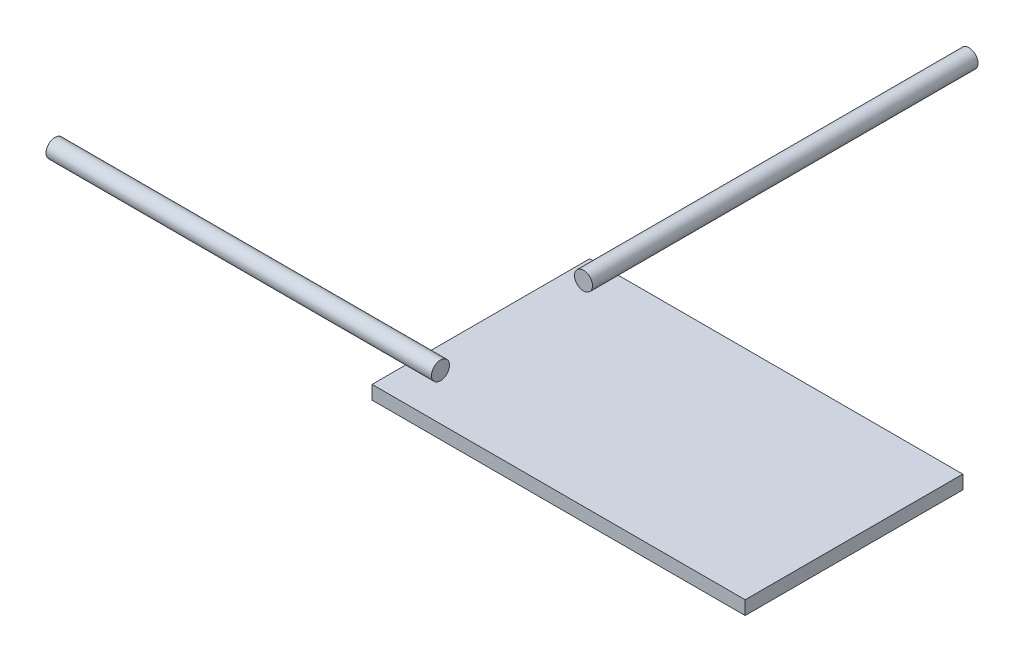
ISO-10303-21;
HEADER;
FILE_DESCRIPTION(('STEP AP214'),'2;1');
FILE_NAME('part.step','',(''),(''),'','','');
FILE_SCHEMA(('AUTOMOTIVE_DESIGN { 1 0 10303 214 1 1 1 1 }'));
ENDSEC;
DATA;
#1=APPLICATION_CONTEXT('core data for automotive mechanical design processes');
#2=APPLICATION_PROTOCOL_DEFINITION('international standard','automotive_design',2000,#1);
#3=PRODUCT_CONTEXT('',#1,'mechanical');
#4=PRODUCT('Part','Part','',(#3));
#5=PRODUCT_RELATED_PRODUCT_CATEGORY('part','',(#4));
#6=PRODUCT_DEFINITION_FORMATION('','',#4);
#7=PRODUCT_DEFINITION_CONTEXT('part definition',#1,'design');
#8=PRODUCT_DEFINITION('design','',#6,#7);
#9=PRODUCT_DEFINITION_SHAPE('','',#8);
#10=(LENGTH_UNIT() NAMED_UNIT(*) SI_UNIT(.MILLI.,.METRE.));
#11=(NAMED_UNIT(*) PLANE_ANGLE_UNIT() SI_UNIT($,.RADIAN.));
#12=(NAMED_UNIT(*) SI_UNIT($,.STERADIAN.) SOLID_ANGLE_UNIT());
#13=UNCERTAINTY_MEASURE_WITH_UNIT(LENGTH_MEASURE(1.E-05),#10,'distance_accuracy_value','');
#14=(GEOMETRIC_REPRESENTATION_CONTEXT(3) GLOBAL_UNCERTAINTY_ASSIGNED_CONTEXT((#13)) GLOBAL_UNIT_ASSIGNED_CONTEXT((#10,
#11,#12)) REPRESENTATION_CONTEXT('',''));
#15=CARTESIAN_POINT('',(0.,0.,0.));
#16=DIRECTION('',(0.,0.,1.));
#17=DIRECTION('',(1.,0.,0.));
#18=AXIS2_PLACEMENT_3D('',#15,#16,#17);
#19=CARTESIAN_POINT('',(-43.5,1.825,5.75000000000001));
#20=DIRECTION('',(1.,0.,0.));
#21=DIRECTION('',(0.,0.,-1.));
#22=AXIS2_PLACEMENT_3D('',#19,#20,#21);
#23=CYLINDRICAL_SURFACE('',#22,0.725);
#24=CARTESIAN_POINT('',(-43.5,1.825,5.75000000000001));
#25=DIRECTION('',(-1.,0.,0.));
#26=DIRECTION('',(0.,0.,1.));
#27=AXIS2_PLACEMENT_3D('',#24,#25,#26);
#28=CIRCLE('',#27,0.725);
#29=CARTESIAN_POINT('',(-43.5,1.825,5.02500000000001));
#30=VERTEX_POINT('',#29);
#31=EDGE_CURVE('E11',#30,#30,#28,.T.);
#32=CARTESIAN_POINT('',(-12.5,1.825,5.75));
#33=DIRECTION('',(1.,0.,0.));
#34=DIRECTION('',(0.,0.,-1.));
#35=AXIS2_PLACEMENT_3D('',#32,#33,#34);
#36=CIRCLE('',#35,0.725);
#37=CARTESIAN_POINT('',(-12.5,1.825,5.025));
#38=VERTEX_POINT('',#37);
#39=EDGE_CURVE('E46',#38,#38,#36,.T.);
#40=CARTESIAN_POINT('',(-43.5,1.825,5.02500000000001));
#41=CARTESIAN_POINT('',(-43.1770833333333,1.825,5.02500000000001));
#42=CARTESIAN_POINT('',(-42.8541666666667,1.825,5.02500000000001));
#43=CARTESIAN_POINT('',(-42.2083333333333,1.825,5.02500000000001));
#44=CARTESIAN_POINT('',(-41.8854166666667,1.825,5.02500000000001));
#45=CARTESIAN_POINT('',(-41.2395833333333,1.825,5.02500000000001));
#46=CARTESIAN_POINT('',(-40.9166666666667,1.825,5.02500000000001));
#47=CARTESIAN_POINT('',(-40.2708333333333,1.825,5.02500000000001));
#48=CARTESIAN_POINT('',(-39.9479166666667,1.825,5.02500000000001));
#49=CARTESIAN_POINT('',(-39.3020833333333,1.825,5.02500000000001));
#50=CARTESIAN_POINT('',(-38.9791666666667,1.825,5.02500000000001));
#51=CARTESIAN_POINT('',(-38.3333333333333,1.825,5.02500000000001));
#52=CARTESIAN_POINT('',(-38.0104166666667,1.825,5.02500000000001));
#53=CARTESIAN_POINT('',(-37.3645833333333,1.825,5.02500000000001));
#54=CARTESIAN_POINT('',(-37.0416666666667,1.825,5.02500000000001));
#55=CARTESIAN_POINT('',(-36.3958333333333,1.825,5.02500000000001));
#56=CARTESIAN_POINT('',(-36.0729166666667,1.825,5.02500000000001));
#57=CARTESIAN_POINT('',(-35.4270833333333,1.825,5.02500000000001));
#58=CARTESIAN_POINT('',(-35.1041666666667,1.825,5.02500000000001));
#59=CARTESIAN_POINT('',(-34.4583333333333,1.825,5.02500000000001));
#60=CARTESIAN_POINT('',(-34.1354166666667,1.825,5.02500000000001));
#61=CARTESIAN_POINT('',(-33.4895833333333,1.825,5.02500000000001));
#62=CARTESIAN_POINT('',(-33.1666666666667,1.825,5.02500000000001));
#63=CARTESIAN_POINT('',(-32.5208333333333,1.825,5.02500000000001));
#64=CARTESIAN_POINT('',(-32.1979166666667,1.825,5.02500000000001));
#65=CARTESIAN_POINT('',(-31.5520833333333,1.825,5.02500000000001));
#66=CARTESIAN_POINT('',(-31.2291666666667,1.825,5.02500000000001));
#67=CARTESIAN_POINT('',(-30.5833333333333,1.825,5.02500000000001));
#68=CARTESIAN_POINT('',(-30.2604166666667,1.825,5.025));
#69=CARTESIAN_POINT('',(-29.6145833333333,1.825,5.025));
#70=CARTESIAN_POINT('',(-29.2916666666667,1.825,5.025));
#71=CARTESIAN_POINT('',(-28.6458333333333,1.825,5.025));
#72=CARTESIAN_POINT('',(-28.3229166666667,1.825,5.025));
#73=CARTESIAN_POINT('',(-27.6770833333333,1.825,5.025));
#74=CARTESIAN_POINT('',(-27.3541666666667,1.825,5.025));
#75=CARTESIAN_POINT('',(-26.7083333333333,1.825,5.025));
#76=CARTESIAN_POINT('',(-26.3854166666667,1.825,5.025));
#77=CARTESIAN_POINT('',(-25.7395833333333,1.825,5.025));
#78=CARTESIAN_POINT('',(-25.4166666666667,1.825,5.025));
#79=CARTESIAN_POINT('',(-24.7708333333333,1.825,5.025));
#80=CARTESIAN_POINT('',(-24.4479166666667,1.825,5.025));
#81=CARTESIAN_POINT('',(-23.8020833333333,1.825,5.025));
#82=CARTESIAN_POINT('',(-23.4791666666667,1.825,5.025));
#83=CARTESIAN_POINT('',(-22.8333333333333,1.825,5.025));
#84=CARTESIAN_POINT('',(-22.5104166666667,1.825,5.025));
#85=CARTESIAN_POINT('',(-21.8645833333333,1.825,5.025));
#86=CARTESIAN_POINT('',(-21.5416666666667,1.825,5.025));
#87=CARTESIAN_POINT('',(-20.8958333333333,1.825,5.025));
#88=CARTESIAN_POINT('',(-20.5729166666667,1.825,5.025));
#89=CARTESIAN_POINT('',(-19.9270833333333,1.825,5.025));
#90=CARTESIAN_POINT('',(-19.6041666666667,1.825,5.025));
#91=CARTESIAN_POINT('',(-18.9583333333333,1.825,5.025));
#92=CARTESIAN_POINT('',(-18.6354166666667,1.825,5.025));
#93=CARTESIAN_POINT('',(-17.9895833333333,1.825,5.025));
#94=CARTESIAN_POINT('',(-17.6666666666667,1.825,5.025));
#95=CARTESIAN_POINT('',(-17.0208333333333,1.825,5.025));
#96=CARTESIAN_POINT('',(-16.6979166666667,1.825,5.025));
#97=CARTESIAN_POINT('',(-16.0520833333333,1.825,5.025));
#98=CARTESIAN_POINT('',(-15.7291666666667,1.825,5.025));
#99=CARTESIAN_POINT('',(-15.0833333333333,1.825,5.025));
#100=CARTESIAN_POINT('',(-14.7604166666667,1.825,5.025));
#101=CARTESIAN_POINT('',(-14.1145833333333,1.825,5.025));
#102=CARTESIAN_POINT('',(-13.7916666666667,1.825,5.025));
#103=CARTESIAN_POINT('',(-13.1458333333333,1.825,5.025));
#104=CARTESIAN_POINT('',(-12.8229166666667,1.825,5.025));
#105=CARTESIAN_POINT('',(-12.5,1.825,5.025));
#106=B_SPLINE_CURVE_WITH_KNOTS('',3,(#40,#41,#42,#43,#44,#45,#46,#47,#48,#49,#50,#51,#52,#53,
#54,#55,#56,#57,#58,#59,#60,#61,#62,#63,#64,#65,#66,#67,#68,#69,#70,#71,#72,#73,#74,#75,#76,#77,
#78,#79,#80,#81,#82,#83,#84,#85,#86,#87,#88,#89,#90,#91,#92,#93,#94,#95,#96,#97,#98,#99,#100,
#101,#102,#103,#104,#105),.UNSPECIFIED.,.F.,.F.,(4,2,2,2,2,2,2,2,2,2,2,2,2,2,2,2,2,2,2,2,2,2,2,
2,2,2,2,2,2,2,2,2,4),(0.,0.968750000000004,1.9375,2.90625000000001,3.875,4.84375,
5.81250000000001,6.78125,7.75,8.71875,9.6875,10.65625,11.625,12.59375,13.5625,14.53125,15.5,
16.46875,17.4375,18.40625,19.375,20.34375,21.3125,22.28125,23.25,24.21875,25.1875,26.15625,
27.125,28.09375,29.0625,30.03125,31.),.UNSPECIFIED.);
#107=EDGE_CURVE('BSEAM40',#30,#38,#106,.T.);
#108=ORIENTED_EDGE('',*,*,#31,.F.);
#109=ORIENTED_EDGE('',*,*,#39,.F.);
#110=ORIENTED_EDGE('',*,*,#107,.T.);
#111=ORIENTED_EDGE('',*,*,#107,.F.);
#112=EDGE_LOOP('',(#108,#110,#109,#111));
#113=FACE_BOUND('',#112,.T.);
#114=ADVANCED_FACE('F40',(#113),#23,.T.);
#115=CARTESIAN_POINT('',(-43.5,1.825,5.75000000000001));
#116=DIRECTION('',(-1.,0.,0.));
#117=DIRECTION('',(0.,0.,1.));
#118=AXIS2_PLACEMENT_3D('',#115,#116,#117);
#119=PLANE('',#118);
#120=ORIENTED_EDGE('',*,*,#31,.T.);
#121=EDGE_LOOP('',(#120));
#122=FACE_BOUND('',#121,.T.);
#123=ADVANCED_FACE('F55',(#122),#119,.T.);
#124=CARTESIAN_POINT('',(-12.5,1.825,5.75));
#125=DIRECTION('',(1.,0.,0.));
#126=DIRECTION('',(0.,0.,-1.));
#127=AXIS2_PLACEMENT_3D('',#124,#125,#126);
#128=PLANE('',#127);
#129=ORIENTED_EDGE('',*,*,#39,.T.);
#130=EDGE_LOOP('',(#129));
#131=FACE_BOUND('',#130,.T.);
#132=ADVANCED_FACE('F52',(#131),#128,.T.);
#133=CLOSED_SHELL('',(#114,#123,#132));
#134=MANIFOLD_SOLID_BREP('B2',#133);
#135=CARTESIAN_POINT('',(-13.,1.825,-37.25));
#136=DIRECTION('',(0.,0.,1.));
#137=DIRECTION('',(1.,0.,0.));
#138=AXIS2_PLACEMENT_3D('',#135,#136,#137);
#139=CYLINDRICAL_SURFACE('',#138,0.725);
#140=CARTESIAN_POINT('',(-13.,1.825,-37.25));
#141=DIRECTION('',(0.,0.,-1.));
#142=DIRECTION('',(-1.,0.,0.));
#143=AXIS2_PLACEMENT_3D('',#140,#141,#142);
#144=CIRCLE('',#143,0.725);
#145=CARTESIAN_POINT('',(-12.275,1.825,-37.25));
#146=VERTEX_POINT('',#145);
#147=EDGE_CURVE('E39',#146,#146,#144,.T.);
#148=CARTESIAN_POINT('',(-13.,1.825,-6.25));
#149=DIRECTION('',(0.,0.,1.));
#150=DIRECTION('',(1.,0.,0.));
#151=AXIS2_PLACEMENT_3D('',#148,#149,#150);
#152=CIRCLE('',#151,0.725);
#153=CARTESIAN_POINT('',(-12.275,1.825,-6.25));
#154=VERTEX_POINT('',#153);
#155=EDGE_CURVE('E99',#154,#154,#152,.T.);
#156=CARTESIAN_POINT('',(-12.275,1.825,-37.25));
#157=CARTESIAN_POINT('',(-12.275,1.825,-36.9270833333333));
#158=CARTESIAN_POINT('',(-12.275,1.825,-36.6041666666667));
#159=CARTESIAN_POINT('',(-12.275,1.825,-35.9583333333333));
#160=CARTESIAN_POINT('',(-12.275,1.825,-35.6354166666667));
#161=CARTESIAN_POINT('',(-12.275,1.825,-34.9895833333333));
#162=CARTESIAN_POINT('',(-12.275,1.825,-34.6666666666667));
#163=CARTESIAN_POINT('',(-12.275,1.825,-34.0208333333333));
#164=CARTESIAN_POINT('',(-12.275,1.825,-33.6979166666667));
#165=CARTESIAN_POINT('',(-12.275,1.825,-33.0520833333333));
#166=CARTESIAN_POINT('',(-12.275,1.825,-32.7291666666667));
#167=CARTESIAN_POINT('',(-12.275,1.825,-32.0833333333333));
#168=CARTESIAN_POINT('',(-12.275,1.825,-31.7604166666667));
#169=CARTESIAN_POINT('',(-12.275,1.825,-31.1145833333333));
#170=CARTESIAN_POINT('',(-12.275,1.825,-30.7916666666667));
#171=CARTESIAN_POINT('',(-12.275,1.825,-30.1458333333333));
#172=CARTESIAN_POINT('',(-12.275,1.825,-29.8229166666667));
#173=CARTESIAN_POINT('',(-12.275,1.825,-29.1770833333333));
#174=CARTESIAN_POINT('',(-12.275,1.825,-28.8541666666667));
#175=CARTESIAN_POINT('',(-12.275,1.825,-28.2083333333333));
#176=CARTESIAN_POINT('',(-12.275,1.825,-27.8854166666667));
#177=CARTESIAN_POINT('',(-12.275,1.825,-27.2395833333333));
#178=CARTESIAN_POINT('',(-12.275,1.825,-26.9166666666667));
#179=CARTESIAN_POINT('',(-12.275,1.825,-26.2708333333333));
#180=CARTESIAN_POINT('',(-12.275,1.825,-25.9479166666667));
#181=CARTESIAN_POINT('',(-12.275,1.825,-25.3020833333333));
#182=CARTESIAN_POINT('',(-12.275,1.825,-24.9791666666667));
#183=CARTESIAN_POINT('',(-12.275,1.825,-24.3333333333333));
#184=CARTESIAN_POINT('',(-12.275,1.825,-24.0104166666667));
#185=CARTESIAN_POINT('',(-12.275,1.825,-23.3645833333333));
#186=CARTESIAN_POINT('',(-12.275,1.825,-23.0416666666667));
#187=CARTESIAN_POINT('',(-12.275,1.825,-22.3958333333333));
#188=CARTESIAN_POINT('',(-12.275,1.825,-22.0729166666667));
#189=CARTESIAN_POINT('',(-12.275,1.825,-21.4270833333333));
#190=CARTESIAN_POINT('',(-12.275,1.825,-21.1041666666667));
#191=CARTESIAN_POINT('',(-12.275,1.825,-20.4583333333333));
#192=CARTESIAN_POINT('',(-12.275,1.825,-20.1354166666667));
#193=CARTESIAN_POINT('',(-12.275,1.825,-19.4895833333333));
#194=CARTESIAN_POINT('',(-12.275,1.825,-19.1666666666667));
#195=CARTESIAN_POINT('',(-12.275,1.825,-18.5208333333333));
#196=CARTESIAN_POINT('',(-12.275,1.825,-18.1979166666667));
#197=CARTESIAN_POINT('',(-12.275,1.825,-17.5520833333333));
#198=CARTESIAN_POINT('',(-12.275,1.825,-17.2291666666667));
#199=CARTESIAN_POINT('',(-12.275,1.825,-16.5833333333333));
#200=CARTESIAN_POINT('',(-12.275,1.825,-16.2604166666667));
#201=CARTESIAN_POINT('',(-12.275,1.825,-15.6145833333333));
#202=CARTESIAN_POINT('',(-12.275,1.825,-15.2916666666667));
#203=CARTESIAN_POINT('',(-12.275,1.825,-14.6458333333333));
#204=CARTESIAN_POINT('',(-12.275,1.825,-14.3229166666667));
#205=CARTESIAN_POINT('',(-12.275,1.825,-13.6770833333333));
#206=CARTESIAN_POINT('',(-12.275,1.825,-13.3541666666667));
#207=CARTESIAN_POINT('',(-12.275,1.825,-12.7083333333333));
#208=CARTESIAN_POINT('',(-12.275,1.825,-12.3854166666667));
#209=CARTESIAN_POINT('',(-12.275,1.825,-11.7395833333333));
#210=CARTESIAN_POINT('',(-12.275,1.825,-11.4166666666667));
#211=CARTESIAN_POINT('',(-12.275,1.825,-10.7708333333333));
#212=CARTESIAN_POINT('',(-12.275,1.825,-10.4479166666667));
#213=CARTESIAN_POINT('',(-12.275,1.825,-9.80208333333333));
#214=CARTESIAN_POINT('',(-12.275,1.825,-9.47916666666667));
#215=CARTESIAN_POINT('',(-12.275,1.825,-8.83333333333334));
#216=CARTESIAN_POINT('',(-12.275,1.825,-8.51041666666667));
#217=CARTESIAN_POINT('',(-12.275,1.825,-7.86458333333334));
#218=CARTESIAN_POINT('',(-12.275,1.825,-7.54166666666667));
#219=CARTESIAN_POINT('',(-12.275,1.825,-6.89583333333334));
#220=CARTESIAN_POINT('',(-12.275,1.825,-6.57291666666667));
#221=CARTESIAN_POINT('',(-12.275,1.825,-6.25));
#222=B_SPLINE_CURVE_WITH_KNOTS('',3,(#156,#157,#158,#159,#160,#161,#162,#163,#164,#165,#166,
#167,#168,#169,#170,#171,#172,#173,#174,#175,#176,#177,#178,#179,#180,#181,#182,#183,#184,#185,
#186,#187,#188,#189,#190,#191,#192,#193,#194,#195,#196,#197,#198,#199,#200,#201,#202,#203,#204,
#205,#206,#207,#208,#209,#210,#211,#212,#213,#214,#215,#216,#217,#218,#219,#220,#221),
.UNSPECIFIED.,.F.,.F.,(4,2,2,2,2,2,2,2,2,2,2,2,2,2,2,2,2,2,2,2,2,2,2,2,2,2,2,2,2,2,2,2,4),(0.,
0.968750000000004,1.9375,2.90625000000001,3.875,4.84375,5.81250000000001,6.78125,7.75,8.71875,
9.6875,10.65625,11.625,12.59375,13.5625,14.53125,15.5,16.46875,17.4375,18.40625,19.375,20.34375,
21.3125,22.28125,23.25,24.21875,25.1875,26.15625,27.125,28.09375,29.0625,30.03125,31.),.UNSPECIFIED.);
#223=EDGE_CURVE('BSEAM93',#146,#154,#222,.T.);
#224=ORIENTED_EDGE('',*,*,#147,.F.);
#225=ORIENTED_EDGE('',*,*,#155,.F.);
#226=ORIENTED_EDGE('',*,*,#223,.T.);
#227=ORIENTED_EDGE('',*,*,#223,.F.);
#228=EDGE_LOOP('',(#224,#226,#225,#227));
#229=FACE_BOUND('',#228,.T.);
#230=ADVANCED_FACE('F93',(#229),#139,.T.);
#231=CARTESIAN_POINT('',(-13.,1.825,-37.25));
#232=DIRECTION('',(0.,0.,-1.));
#233=DIRECTION('',(-1.,0.,0.));
#234=AXIS2_PLACEMENT_3D('',#231,#232,#233);
#235=PLANE('',#234);
#236=ORIENTED_EDGE('',*,*,#147,.T.);
#237=EDGE_LOOP('',(#236));
#238=FACE_BOUND('',#237,.T.);
#239=ADVANCED_FACE('F108',(#238),#235,.T.);
#240=CARTESIAN_POINT('',(-13.,1.825,-6.25));
#241=DIRECTION('',(0.,0.,1.));
#242=DIRECTION('',(1.,0.,0.));
#243=AXIS2_PLACEMENT_3D('',#240,#241,#242);
#244=PLANE('',#243);
#245=ORIENTED_EDGE('',*,*,#155,.T.);
#246=EDGE_LOOP('',(#245));
#247=FACE_BOUND('',#246,.T.);
#248=ADVANCED_FACE('F105',(#247),#244,.T.);
#249=CLOSED_SHELL('',(#230,#239,#248));
#250=MANIFOLD_SOLID_BREP('B6',#249);
#251=CARTESIAN_POINT('',(-15.,1.1,-8.75));
#252=DIRECTION('',(1.,0.,0.));
#253=DIRECTION('',(0.,0.,-1.));
#254=AXIS2_PLACEMENT_3D('',#251,#252,#253);
#255=PLANE('',#254);
#256=DIRECTION('',(0.,0.,1.));
#257=VECTOR('',#256,1.);
#258=CARTESIAN_POINT('',(-15.,0.,-8.75));
#259=LINE('',#258,#257);
#260=CARTESIAN_POINT('',(-15.,0.,-8.75));
#261=VERTEX_POINT('',#260);
#262=CARTESIAN_POINT('',(-15.,0.,8.75));
#263=VERTEX_POINT('',#262);
#264=EDGE_CURVE('E199',#261,#263,#259,.T.);
#265=ORIENTED_EDGE('',*,*,#264,.T.);
#266=DIRECTION('',(0.,-1.,0.));
#267=VECTOR('',#266,1.);
#268=CARTESIAN_POINT('',(-15.,1.1,8.75));
#269=LINE('',#268,#267);
#270=CARTESIAN_POINT('',(-15.,1.1,8.75));
#271=VERTEX_POINT('',#270);
#272=EDGE_CURVE('E91',#271,#263,#269,.T.);
#273=ORIENTED_EDGE('',*,*,#272,.F.);
#274=DIRECTION('',(0.,0.,1.));
#275=VECTOR('',#274,1.);
#276=CARTESIAN_POINT('',(-15.,1.1,-8.75));
#277=LINE('',#276,#275);
#278=CARTESIAN_POINT('',(-15.,1.1,5.75000000000001));
#279=VERTEX_POINT('',#278);
#280=EDGE_CURVE('E151',#279,#271,#277,.T.);
#281=ORIENTED_EDGE('',*,*,#280,.F.);
#282=CARTESIAN_POINT('',(-15.,1.1,-8.75));
#283=VERTEX_POINT('',#282);
#284=EDGE_CURVE('E187',#283,#279,#277,.T.);
#285=ORIENTED_EDGE('',*,*,#284,.F.);
#286=DIRECTION('',(0.,-1.,0.));
#287=VECTOR('',#286,1.);
#288=CARTESIAN_POINT('',(-15.,1.1,-8.75));
#289=LINE('',#288,#287);
#290=EDGE_CURVE('E200',#283,#261,#289,.T.);
#291=ORIENTED_EDGE('',*,*,#290,.T.);
#292=EDGE_LOOP('',(#265,#273,#281,#285,#291));
#293=FACE_BOUND('',#292,.T.);
#294=ADVANCED_FACE('F137',(#293),#255,.F.);
#295=CARTESIAN_POINT('',(15.,1.1,8.75));
#296=DIRECTION('',(0.,0.,-1.));
#297=DIRECTION('',(-1.,0.,0.));
#298=AXIS2_PLACEMENT_3D('',#295,#296,#297);
#299=PLANE('',#298);
#300=DIRECTION('',(1.,0.,0.));
#301=VECTOR('',#300,1.);
#302=CARTESIAN_POINT('',(15.,0.,8.75));
#303=LINE('',#302,#301);
#304=CARTESIAN_POINT('',(15.,0.,8.75));
#305=VERTEX_POINT('',#304);
#306=EDGE_CURVE('E203',#263,#305,#303,.T.);
#307=ORIENTED_EDGE('',*,*,#306,.T.);
#308=DIRECTION('',(0.,-1.,0.));
#309=VECTOR('',#308,1.);
#310=CARTESIAN_POINT('',(15.,1.1,8.75));
#311=LINE('',#310,#309);
#312=CARTESIAN_POINT('',(15.,1.1,8.75));
#313=VERTEX_POINT('',#312);
#314=EDGE_CURVE('E144',#313,#305,#311,.T.);
#315=ORIENTED_EDGE('',*,*,#314,.F.);
#316=DIRECTION('',(1.,0.,0.));
#317=VECTOR('',#316,1.);
#318=CARTESIAN_POINT('',(15.,1.1,8.75));
#319=LINE('',#318,#317);
#320=EDGE_CURVE('E185',#271,#313,#319,.T.);
#321=ORIENTED_EDGE('',*,*,#320,.F.);
#322=ORIENTED_EDGE('',*,*,#272,.T.);
#323=EDGE_LOOP('',(#307,#315,#321,#322));
#324=FACE_BOUND('',#323,.T.);
#325=ADVANCED_FACE('F191',(#324),#299,.F.);
#326=CARTESIAN_POINT('',(15.,1.1,-8.75));
#327=DIRECTION('',(-1.,0.,0.));
#328=DIRECTION('',(0.,0.,1.));
#329=AXIS2_PLACEMENT_3D('',#326,#327,#328);
#330=PLANE('',#329);
#331=DIRECTION('',(0.,0.,-1.));
#332=VECTOR('',#331,1.);
#333=CARTESIAN_POINT('',(15.,0.,-8.75));
#334=LINE('',#333,#332);
#335=CARTESIAN_POINT('',(15.,0.,-8.75));
#336=VERTEX_POINT('',#335);
#337=EDGE_CURVE('E205',#305,#336,#334,.T.);
#338=ORIENTED_EDGE('',*,*,#337,.T.);
#339=DIRECTION('',(0.,-1.,0.));
#340=VECTOR('',#339,1.);
#341=CARTESIAN_POINT('',(15.,1.1,-8.75));
#342=LINE('',#341,#340);
#343=CARTESIAN_POINT('',(15.,1.1,-8.75));
#344=VERTEX_POINT('',#343);
#345=EDGE_CURVE('E214',#344,#336,#342,.T.);
#346=ORIENTED_EDGE('',*,*,#345,.F.);
#347=DIRECTION('',(0.,0.,-1.));
#348=VECTOR('',#347,1.);
#349=CARTESIAN_POINT('',(15.,1.1,-8.75));
#350=LINE('',#349,#348);
#351=EDGE_CURVE('E195',#313,#344,#350,.T.);
#352=ORIENTED_EDGE('',*,*,#351,.F.);
#353=ORIENTED_EDGE('',*,*,#314,.T.);
#354=EDGE_LOOP('',(#338,#346,#352,#353));
#355=FACE_BOUND('',#354,.T.);
#356=ADVANCED_FACE('F218',(#355),#330,.F.);
#357=CARTESIAN_POINT('',(15.,1.1,-8.75));
#358=DIRECTION('',(0.,0.,1.));
#359=DIRECTION('',(1.,0.,0.));
#360=AXIS2_PLACEMENT_3D('',#357,#358,#359);
#361=PLANE('',#360);
#362=DIRECTION('',(-1.,0.,0.));
#363=VECTOR('',#362,1.);
#364=CARTESIAN_POINT('',(15.,0.,-8.75));
#365=LINE('',#364,#363);
#366=EDGE_CURVE('E188',#336,#261,#365,.T.);
#367=ORIENTED_EDGE('',*,*,#366,.T.);
#368=ORIENTED_EDGE('',*,*,#290,.F.);
#369=DIRECTION('',(-1.,0.,0.));
#370=VECTOR('',#369,1.);
#371=CARTESIAN_POINT('',(15.,1.1,-8.75));
#372=LINE('',#371,#370);
#373=CARTESIAN_POINT('',(-13.,1.1,-8.75));
#374=VERTEX_POINT('',#373);
#375=EDGE_CURVE('E159',#374,#283,#372,.T.);
#376=ORIENTED_EDGE('',*,*,#375,.F.);
#377=EDGE_CURVE('E208',#344,#374,#372,.T.);
#378=ORIENTED_EDGE('',*,*,#377,.F.);
#379=ORIENTED_EDGE('',*,*,#345,.T.);
#380=EDGE_LOOP('',(#367,#368,#376,#378,#379));
#381=FACE_BOUND('',#380,.T.);
#382=ADVANCED_FACE('F221',(#381),#361,.F.);
#383=CARTESIAN_POINT('',(0.,1.1,0.));
#384=DIRECTION('',(0.,-1.,0.));
#385=DIRECTION('',(0.,0.,-1.));
#386=AXIS2_PLACEMENT_3D('',#383,#384,#385);
#387=PLANE('',#386);
#388=ORIENTED_EDGE('',*,*,#284,.T.);
#389=ORIENTED_EDGE('',*,*,#280,.T.);
#390=ORIENTED_EDGE('',*,*,#320,.T.);
#391=ORIENTED_EDGE('',*,*,#351,.T.);
#392=ORIENTED_EDGE('',*,*,#377,.T.);
#393=ORIENTED_EDGE('',*,*,#375,.T.);
#394=EDGE_LOOP('',(#388,#389,#390,#391,#392,#393));
#395=FACE_BOUND('',#394,.T.);
#396=ADVANCED_FACE('F184',(#395),#387,.F.);
#397=CARTESIAN_POINT('',(0.,0.,0.));
#398=DIRECTION('',(0.,-1.,0.));
#399=DIRECTION('',(0.,0.,-1.));
#400=AXIS2_PLACEMENT_3D('',#397,#398,#399);
#401=PLANE('',#400);
#402=ORIENTED_EDGE('',*,*,#264,.F.);
#403=ORIENTED_EDGE('',*,*,#366,.F.);
#404=ORIENTED_EDGE('',*,*,#337,.F.);
#405=ORIENTED_EDGE('',*,*,#306,.F.);
#406=EDGE_LOOP('',(#402,#403,#404,#405));
#407=FACE_BOUND('',#406,.T.);
#408=ADVANCED_FACE('F220',(#407),#401,.T.);
#409=CLOSED_SHELL('',(#294,#325,#356,#382,#396,#408));
#410=MANIFOLD_SOLID_BREP('B34',#409);
#411=ADVANCED_BREP_SHAPE_REPRESENTATION('',(#18,#134,#250,#410),#14);
#412=SHAPE_DEFINITION_REPRESENTATION(#9,#411);
ENDSEC;
END-ISO-10303-21;
